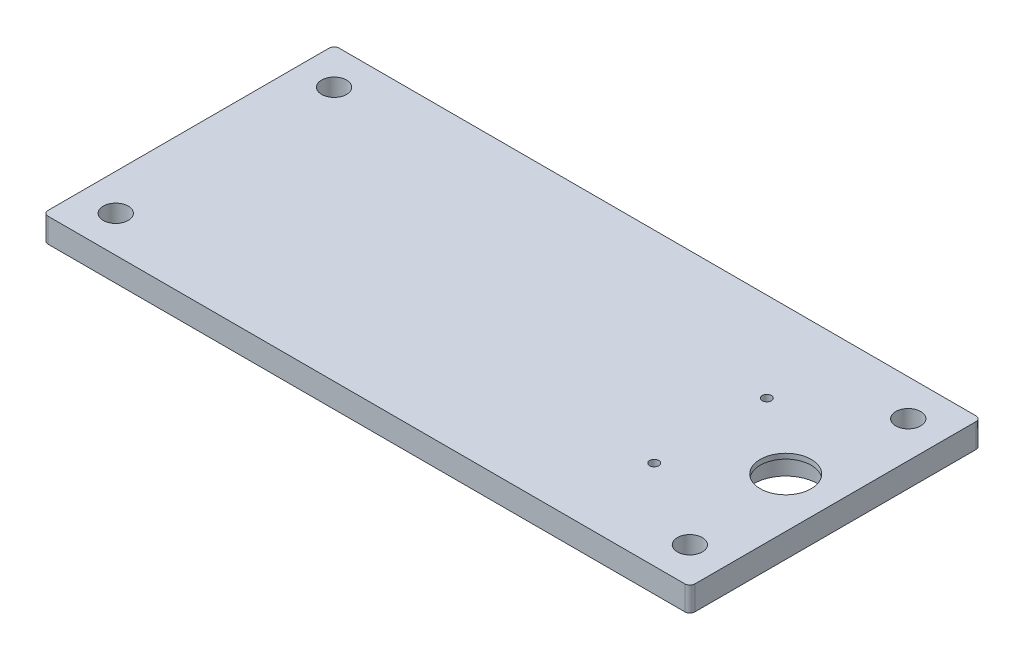
ISO-10303-21;
HEADER;
FILE_DESCRIPTION(('STEP AP214'),'2;1');
FILE_NAME('part.step','',(''),(''),'','','');
FILE_SCHEMA(('AUTOMOTIVE_DESIGN { 1 0 10303 214 1 1 1 1 }'));
ENDSEC;
DATA;
#1=APPLICATION_CONTEXT('core data for automotive mechanical design processes');
#2=APPLICATION_PROTOCOL_DEFINITION('international standard','automotive_design',2000,#1);
#3=PRODUCT_CONTEXT('',#1,'mechanical');
#4=PRODUCT('Part','Part','',(#3));
#5=PRODUCT_RELATED_PRODUCT_CATEGORY('part','',(#4));
#6=PRODUCT_DEFINITION_FORMATION('','',#4);
#7=PRODUCT_DEFINITION_CONTEXT('part definition',#1,'design');
#8=PRODUCT_DEFINITION('design','',#6,#7);
#9=PRODUCT_DEFINITION_SHAPE('','',#8);
#10=(LENGTH_UNIT() NAMED_UNIT(*) SI_UNIT(.MILLI.,.METRE.));
#11=(NAMED_UNIT(*) PLANE_ANGLE_UNIT() SI_UNIT($,.RADIAN.));
#12=(NAMED_UNIT(*) SI_UNIT($,.STERADIAN.) SOLID_ANGLE_UNIT());
#13=UNCERTAINTY_MEASURE_WITH_UNIT(LENGTH_MEASURE(1.E-05),#10,'distance_accuracy_value','');
#14=(GEOMETRIC_REPRESENTATION_CONTEXT(3) GLOBAL_UNCERTAINTY_ASSIGNED_CONTEXT((#13)) GLOBAL_UNIT_ASSIGNED_CONTEXT((#10,
#11,#12)) REPRESENTATION_CONTEXT('',''));
#15=CARTESIAN_POINT('',(0.,0.,0.));
#16=DIRECTION('',(0.,0.,1.));
#17=DIRECTION('',(1.,0.,0.));
#18=AXIS2_PLACEMENT_3D('',#15,#16,#17);
#19=CARTESIAN_POINT('',(107.475,0.,0.));
#20=DIRECTION('',(0.,1.,0.));
#21=DIRECTION('',(0.,0.,1.));
#22=AXIS2_PLACEMENT_3D('',#19,#20,#21);
#23=CYLINDRICAL_SURFACE('',#22,9.99999999999999);
#24=CARTESIAN_POINT('',(107.475,9.525,0.));
#25=DIRECTION('',(0.,1.,0.));
#26=DIRECTION('',(0.,0.,1.));
#27=AXIS2_PLACEMENT_3D('',#24,#25,#26);
#28=CIRCLE('',#27,9.99999999999999);
#29=CARTESIAN_POINT('',(107.475,9.525,9.99999999999999));
#30=VERTEX_POINT('',#29);
#31=EDGE_CURVE('E138',#30,#30,#28,.T.);
#32=CARTESIAN_POINT('',(107.475,7.525,0.));
#33=DIRECTION('',(0.,-1.,0.));
#34=DIRECTION('',(0.,0.,-1.));
#35=AXIS2_PLACEMENT_3D('',#32,#33,#34);
#36=CIRCLE('',#35,9.99999999999999);
#37=CARTESIAN_POINT('',(107.475,7.525,9.99999999999999));
#38=VERTEX_POINT('',#37);
#39=EDGE_CURVE('E228',#38,#38,#36,.F.);
#40=CARTESIAN_POINT('',(107.475,9.525,9.99999999999999));
#41=CARTESIAN_POINT('',(107.475,9.50416666666667,9.99999999999999));
#42=CARTESIAN_POINT('',(107.475,9.48333333333333,9.99999999999999));
#43=CARTESIAN_POINT('',(107.475,9.44166666666667,9.99999999999999));
#44=CARTESIAN_POINT('',(107.475,9.42083333333333,9.99999999999999));
#45=CARTESIAN_POINT('',(107.475,9.37916666666667,9.99999999999999));
#46=CARTESIAN_POINT('',(107.475,9.35833333333333,9.99999999999999));
#47=CARTESIAN_POINT('',(107.475,9.31666666666667,9.99999999999999));
#48=CARTESIAN_POINT('',(107.475,9.29583333333333,9.99999999999999));
#49=CARTESIAN_POINT('',(107.475,9.25416666666667,9.99999999999999));
#50=CARTESIAN_POINT('',(107.475,9.23333333333333,9.99999999999999));
#51=CARTESIAN_POINT('',(107.475,9.19166666666667,9.99999999999999));
#52=CARTESIAN_POINT('',(107.475,9.17083333333333,9.99999999999999));
#53=CARTESIAN_POINT('',(107.475,9.12916666666667,9.99999999999999));
#54=CARTESIAN_POINT('',(107.475,9.10833333333333,9.99999999999999));
#55=CARTESIAN_POINT('',(107.475,9.06666666666667,9.99999999999999));
#56=CARTESIAN_POINT('',(107.475,9.04583333333333,9.99999999999999));
#57=CARTESIAN_POINT('',(107.475,9.00416666666667,9.99999999999999));
#58=CARTESIAN_POINT('',(107.475,8.98333333333333,9.99999999999999));
#59=CARTESIAN_POINT('',(107.475,8.94166666666667,9.99999999999999));
#60=CARTESIAN_POINT('',(107.475,8.92083333333333,9.99999999999999));
#61=CARTESIAN_POINT('',(107.475,8.87916666666667,9.99999999999999));
#62=CARTESIAN_POINT('',(107.475,8.85833333333333,9.99999999999999));
#63=CARTESIAN_POINT('',(107.475,8.81666666666667,9.99999999999999));
#64=CARTESIAN_POINT('',(107.475,8.79583333333333,9.99999999999999));
#65=CARTESIAN_POINT('',(107.475,8.75416666666667,9.99999999999999));
#66=CARTESIAN_POINT('',(107.475,8.73333333333333,9.99999999999999));
#67=CARTESIAN_POINT('',(107.475,8.69166666666667,9.99999999999999));
#68=CARTESIAN_POINT('',(107.475,8.67083333333333,9.99999999999999));
#69=CARTESIAN_POINT('',(107.475,8.62916666666667,9.99999999999999));
#70=CARTESIAN_POINT('',(107.475,8.60833333333333,9.99999999999999));
#71=CARTESIAN_POINT('',(107.475,8.56666666666667,9.99999999999999));
#72=CARTESIAN_POINT('',(107.475,8.54583333333334,9.99999999999999));
#73=CARTESIAN_POINT('',(107.475,8.50416666666667,9.99999999999999));
#74=CARTESIAN_POINT('',(107.475,8.48333333333334,9.99999999999999));
#75=CARTESIAN_POINT('',(107.475,8.44166666666667,9.99999999999999));
#76=CARTESIAN_POINT('',(107.475,8.42083333333334,9.99999999999999));
#77=CARTESIAN_POINT('',(107.475,8.37916666666667,9.99999999999999));
#78=CARTESIAN_POINT('',(107.475,8.35833333333334,9.99999999999999));
#79=CARTESIAN_POINT('',(107.475,8.31666666666667,9.99999999999999));
#80=CARTESIAN_POINT('',(107.475,8.29583333333334,9.99999999999999));
#81=CARTESIAN_POINT('',(107.475,8.25416666666667,9.99999999999999));
#82=CARTESIAN_POINT('',(107.475,8.23333333333334,9.99999999999999));
#83=CARTESIAN_POINT('',(107.475,8.19166666666667,9.99999999999999));
#84=CARTESIAN_POINT('',(107.475,8.17083333333334,9.99999999999999));
#85=CARTESIAN_POINT('',(107.475,8.12916666666667,9.99999999999999));
#86=CARTESIAN_POINT('',(107.475,8.10833333333334,9.99999999999999));
#87=CARTESIAN_POINT('',(107.475,8.06666666666667,9.99999999999999));
#88=CARTESIAN_POINT('',(107.475,8.04583333333334,9.99999999999999));
#89=CARTESIAN_POINT('',(107.475,8.00416666666667,9.99999999999999));
#90=CARTESIAN_POINT('',(107.475,7.98333333333334,9.99999999999999));
#91=CARTESIAN_POINT('',(107.475,7.94166666666667,9.99999999999999));
#92=CARTESIAN_POINT('',(107.475,7.92083333333334,9.99999999999999));
#93=CARTESIAN_POINT('',(107.475,7.87916666666667,9.99999999999999));
#94=CARTESIAN_POINT('',(107.475,7.85833333333334,9.99999999999999));
#95=CARTESIAN_POINT('',(107.475,7.81666666666667,9.99999999999999));
#96=CARTESIAN_POINT('',(107.475,7.79583333333334,9.99999999999999));
#97=CARTESIAN_POINT('',(107.475,7.75416666666667,9.99999999999999));
#98=CARTESIAN_POINT('',(107.475,7.73333333333334,9.99999999999999));
#99=CARTESIAN_POINT('',(107.475,7.69166666666667,9.99999999999999));
#100=CARTESIAN_POINT('',(107.475,7.67083333333334,9.99999999999999));
#101=CARTESIAN_POINT('',(107.475,7.62916666666667,9.99999999999999));
#102=CARTESIAN_POINT('',(107.475,7.60833333333334,9.99999999999999));
#103=CARTESIAN_POINT('',(107.475,7.56666666666667,9.99999999999999));
#104=CARTESIAN_POINT('',(107.475,7.54583333333334,9.99999999999999));
#105=CARTESIAN_POINT('',(107.475,7.525,9.99999999999999));
#106=B_SPLINE_CURVE_WITH_KNOTS('',3,(#40,#41,#42,#43,#44,#45,#46,#47,#48,#49,#50,#51,#52,#53,
#54,#55,#56,#57,#58,#59,#60,#61,#62,#63,#64,#65,#66,#67,#68,#69,#70,#71,#72,#73,#74,#75,#76,#77,
#78,#79,#80,#81,#82,#83,#84,#85,#86,#87,#88,#89,#90,#91,#92,#93,#94,#95,#96,#97,#98,#99,#100,
#101,#102,#103,#104,#105),.UNSPECIFIED.,.F.,.F.,(4,2,2,2,2,2,2,2,2,2,2,2,2,2,2,2,2,2,2,2,2,2,2,
2,2,2,2,2,2,2,2,2,4),(0.,0.0625000000000001,0.125,0.1875,0.25,0.3125,0.374999999999999,
0.437499999999999,0.499999999999999,0.562499999999999,0.624999999999999,0.687499999999999,
0.749999999999999,0.812499999999999,0.874999999999999,0.937499999999999,0.999999999999997,
1.0625,1.125,1.1875,1.25,1.3125,1.375,1.4375,1.5,1.5625,1.625,1.6875,1.75,1.8125,1.875,1.9375,
2.),.UNSPECIFIED.);
#107=EDGE_CURVE('BSEAM44',#30,#38,#106,.T.);
#108=ORIENTED_EDGE('',*,*,#31,.T.);
#109=ORIENTED_EDGE('',*,*,#39,.F.);
#110=ORIENTED_EDGE('',*,*,#107,.T.);
#111=ORIENTED_EDGE('',*,*,#107,.F.);
#112=EDGE_LOOP('',(#108,#110,#109,#111));
#113=FACE_BOUND('',#112,.T.);
#114=ADVANCED_FACE('F44',(#113),#23,.F.);
#115=CARTESIAN_POINT('',(127.,9.525,57.15));
#116=DIRECTION('',(-1.,0.,0.));
#117=DIRECTION('',(0.,0.,1.));
#118=AXIS2_PLACEMENT_3D('',#115,#116,#117);
#119=PLANE('',#118);
#120=DIRECTION('',(0.,0.,-1.));
#121=VECTOR('',#120,1.);
#122=CARTESIAN_POINT('',(127.,9.525,57.15));
#123=LINE('',#122,#121);
#124=CARTESIAN_POINT('',(127.,9.525,55.15));
#125=VERTEX_POINT('',#124);
#126=CARTESIAN_POINT('',(127.,9.525,-55.15));
#127=VERTEX_POINT('',#126);
#128=EDGE_CURVE('E133',#125,#127,#123,.T.);
#129=ORIENTED_EDGE('',*,*,#128,.F.);
#130=DIRECTION('',(0.,-1.,0.));
#131=VECTOR('',#130,1.);
#132=CARTESIAN_POINT('',(127.,9.525,55.15));
#133=LINE('',#132,#131);
#134=CARTESIAN_POINT('',(127.,0.,55.15));
#135=VERTEX_POINT('',#134);
#136=EDGE_CURVE('E114',#125,#135,#133,.T.);
#137=ORIENTED_EDGE('',*,*,#136,.T.);
#138=DIRECTION('',(0.,0.,-1.));
#139=VECTOR('',#138,1.);
#140=CARTESIAN_POINT('',(127.,0.,57.15));
#141=LINE('',#140,#139);
#142=CARTESIAN_POINT('',(127.,0.,-55.15));
#143=VERTEX_POINT('',#142);
#144=EDGE_CURVE('E129',#135,#143,#141,.T.);
#145=ORIENTED_EDGE('',*,*,#144,.T.);
#146=DIRECTION('',(0.,-1.,0.));
#147=VECTOR('',#146,1.);
#148=CARTESIAN_POINT('',(127.,9.525,-55.15));
#149=LINE('',#148,#147);
#150=EDGE_CURVE('E132',#143,#127,#149,.F.);
#151=ORIENTED_EDGE('',*,*,#150,.T.);
#152=EDGE_LOOP('',(#129,#137,#145,#151));
#153=FACE_BOUND('',#152,.T.);
#154=ADVANCED_FACE('F130',(#153),#119,.F.);
#155=CARTESIAN_POINT('',(-127.,9.525,-57.15));
#156=DIRECTION('',(0.,0.,1.));
#157=DIRECTION('',(1.,0.,0.));
#158=AXIS2_PLACEMENT_3D('',#155,#156,#157);
#159=PLANE('',#158);
#160=DIRECTION('',(-1.,0.,0.));
#161=VECTOR('',#160,1.);
#162=CARTESIAN_POINT('',(-127.,0.,-57.15));
#163=LINE('',#162,#161);
#164=CARTESIAN_POINT('',(125.,0.,-57.15));
#165=VERTEX_POINT('',#164);
#166=CARTESIAN_POINT('',(-125.,0.,-57.15));
#167=VERTEX_POINT('',#166);
#168=EDGE_CURVE('E140',#165,#167,#163,.T.);
#169=ORIENTED_EDGE('',*,*,#168,.T.);
#170=DIRECTION('',(0.,-1.,0.));
#171=VECTOR('',#170,1.);
#172=CARTESIAN_POINT('',(-125.,9.525,-57.15));
#173=LINE('',#172,#171);
#174=CARTESIAN_POINT('',(-125.,9.525,-57.15));
#175=VERTEX_POINT('',#174);
#176=EDGE_CURVE('E12',#167,#175,#173,.F.);
#177=ORIENTED_EDGE('',*,*,#176,.T.);
#178=DIRECTION('',(-1.,0.,0.));
#179=VECTOR('',#178,1.);
#180=CARTESIAN_POINT('',(-127.,9.525,-57.15));
#181=LINE('',#180,#179);
#182=CARTESIAN_POINT('',(125.,9.525,-57.15));
#183=VERTEX_POINT('',#182);
#184=EDGE_CURVE('E187',#183,#175,#181,.T.);
#185=ORIENTED_EDGE('',*,*,#184,.F.);
#186=DIRECTION('',(0.,-1.,0.));
#187=VECTOR('',#186,1.);
#188=CARTESIAN_POINT('',(125.,9.525,-57.15));
#189=LINE('',#188,#187);
#190=EDGE_CURVE('E52',#183,#165,#189,.T.);
#191=ORIENTED_EDGE('',*,*,#190,.T.);
#192=EDGE_LOOP('',(#169,#177,#185,#191));
#193=FACE_BOUND('',#192,.T.);
#194=ADVANCED_FACE('F183',(#193),#159,.F.);
#195=CARTESIAN_POINT('',(-127.,9.525,57.15));
#196=DIRECTION('',(1.,0.,0.));
#197=DIRECTION('',(0.,0.,-1.));
#198=AXIS2_PLACEMENT_3D('',#195,#196,#197);
#199=PLANE('',#198);
#200=DIRECTION('',(0.,0.,1.));
#201=VECTOR('',#200,1.);
#202=CARTESIAN_POINT('',(-127.,0.,57.15));
#203=LINE('',#202,#201);
#204=CARTESIAN_POINT('',(-127.,0.,-55.15));
#205=VERTEX_POINT('',#204);
#206=CARTESIAN_POINT('',(-127.,0.,55.15));
#207=VERTEX_POINT('',#206);
#208=EDGE_CURVE('E142',#205,#207,#203,.T.);
#209=ORIENTED_EDGE('',*,*,#208,.T.);
#210=DIRECTION('',(0.,-1.,0.));
#211=VECTOR('',#210,1.);
#212=CARTESIAN_POINT('',(-127.,9.525,55.15));
#213=LINE('',#212,#211);
#214=CARTESIAN_POINT('',(-127.,9.525,55.15));
#215=VERTEX_POINT('',#214);
#216=EDGE_CURVE('E58',#207,#215,#213,.F.);
#217=ORIENTED_EDGE('',*,*,#216,.T.);
#218=DIRECTION('',(0.,0.,1.));
#219=VECTOR('',#218,1.);
#220=CARTESIAN_POINT('',(-127.,9.525,57.15));
#221=LINE('',#220,#219);
#222=CARTESIAN_POINT('',(-127.,9.525,-55.15));
#223=VERTEX_POINT('',#222);
#224=EDGE_CURVE('E191',#223,#215,#221,.T.);
#225=ORIENTED_EDGE('',*,*,#224,.F.);
#226=DIRECTION('',(0.,-1.,0.));
#227=VECTOR('',#226,1.);
#228=CARTESIAN_POINT('',(-127.,9.525,-55.15));
#229=LINE('',#228,#227);
#230=EDGE_CURVE('E180',#223,#205,#229,.T.);
#231=ORIENTED_EDGE('',*,*,#230,.T.);
#232=EDGE_LOOP('',(#209,#217,#225,#231));
#233=FACE_BOUND('',#232,.T.);
#234=ADVANCED_FACE('F194',(#233),#199,.F.);
#235=CARTESIAN_POINT('',(-127.,9.525,57.15));
#236=DIRECTION('',(0.,0.,-1.));
#237=DIRECTION('',(-1.,0.,0.));
#238=AXIS2_PLACEMENT_3D('',#235,#236,#237);
#239=PLANE('',#238);
#240=DIRECTION('',(1.,0.,0.));
#241=VECTOR('',#240,1.);
#242=CARTESIAN_POINT('',(-127.,0.,57.15));
#243=LINE('',#242,#241);
#244=CARTESIAN_POINT('',(-125.,0.,57.15));
#245=VERTEX_POINT('',#244);
#246=CARTESIAN_POINT('',(125.,0.,57.15));
#247=VERTEX_POINT('',#246);
#248=EDGE_CURVE('E153',#245,#247,#243,.T.);
#249=ORIENTED_EDGE('',*,*,#248,.T.);
#250=DIRECTION('',(0.,-1.,0.));
#251=VECTOR('',#250,1.);
#252=CARTESIAN_POINT('',(125.,9.525,57.15));
#253=LINE('',#252,#251);
#254=CARTESIAN_POINT('',(125.,9.525,57.15));
#255=VERTEX_POINT('',#254);
#256=EDGE_CURVE('E116',#247,#255,#253,.F.);
#257=ORIENTED_EDGE('',*,*,#256,.T.);
#258=DIRECTION('',(1.,0.,0.));
#259=VECTOR('',#258,1.);
#260=CARTESIAN_POINT('',(-127.,9.525,57.15));
#261=LINE('',#260,#259);
#262=CARTESIAN_POINT('',(-125.,9.525,57.15));
#263=VERTEX_POINT('',#262);
#264=EDGE_CURVE('E150',#263,#255,#261,.T.);
#265=ORIENTED_EDGE('',*,*,#264,.F.);
#266=DIRECTION('',(0.,-1.,0.));
#267=VECTOR('',#266,1.);
#268=CARTESIAN_POINT('',(-125.,9.525,57.15));
#269=LINE('',#268,#267);
#270=EDGE_CURVE('E122',#263,#245,#269,.T.);
#271=ORIENTED_EDGE('',*,*,#270,.T.);
#272=EDGE_LOOP('',(#249,#257,#265,#271));
#273=FACE_BOUND('',#272,.T.);
#274=ADVANCED_FACE('F263',(#273),#239,.F.);
#275=CARTESIAN_POINT('',(0.,9.525,0.));
#276=DIRECTION('',(0.,-1.,0.));
#277=DIRECTION('',(0.,0.,-1.));
#278=AXIS2_PLACEMENT_3D('',#275,#276,#277);
#279=PLANE('',#278);
#280=CARTESIAN_POINT('',(77.95,9.525,22.1));
#281=DIRECTION('',(0.,-1.,0.));
#282=DIRECTION('',(0.,0.,-1.));
#283=AXIS2_PLACEMENT_3D('',#280,#281,#282);
#284=CIRCLE('',#283,1.8);
#285=CARTESIAN_POINT('',(77.95,9.525,20.3));
#286=VERTEX_POINT('',#285);
#287=EDGE_CURVE('E216',#286,#286,#284,.T.);
#288=ORIENTED_EDGE('',*,*,#287,.T.);
#289=EDGE_LOOP('',(#288));
#290=FACE_BOUND('',#289,.T.);
#291=CARTESIAN_POINT('',(77.95,9.525,-22.1));
#292=DIRECTION('',(0.,-1.,0.));
#293=DIRECTION('',(0.,0.,-1.));
#294=AXIS2_PLACEMENT_3D('',#291,#292,#293);
#295=CIRCLE('',#294,1.8);
#296=CARTESIAN_POINT('',(77.95,9.525,-23.9));
#297=VERTEX_POINT('',#296);
#298=EDGE_CURVE('E211',#297,#297,#295,.T.);
#299=ORIENTED_EDGE('',*,*,#298,.T.);
#300=EDGE_LOOP('',(#299));
#301=FACE_BOUND('',#300,.T.);
#302=CARTESIAN_POINT('',(112.7125,9.525,-42.862500000001));
#303=DIRECTION('',(0.,1.,0.));
#304=DIRECTION('',(0.,0.,1.));
#305=AXIS2_PLACEMENT_3D('',#302,#303,#304);
#306=CIRCLE('',#305,4.9022);
#307=CARTESIAN_POINT('',(112.7125,9.525,-37.960300000001));
#308=VERTEX_POINT('',#307);
#309=EDGE_CURVE('E163',#308,#308,#306,.T.);
#310=ORIENTED_EDGE('',*,*,#309,.F.);
#311=EDGE_LOOP('',(#310));
#312=FACE_BOUND('',#311,.T.);
#313=CARTESIAN_POINT('',(112.7125,9.525,42.8674999999988));
#314=DIRECTION('',(0.,1.,0.));
#315=DIRECTION('',(0.,0.,1.));
#316=AXIS2_PLACEMENT_3D('',#313,#314,#315);
#317=CIRCLE('',#316,4.9022);
#318=CARTESIAN_POINT('',(112.7125,9.525,47.7696999999988));
#319=VERTEX_POINT('',#318);
#320=EDGE_CURVE('E160',#319,#319,#317,.T.);
#321=ORIENTED_EDGE('',*,*,#320,.F.);
#322=EDGE_LOOP('',(#321));
#323=FACE_BOUND('',#322,.T.);
#324=CARTESIAN_POINT('',(-112.7175,9.525,42.867499999999));
#325=DIRECTION('',(0.,1.,0.));
#326=DIRECTION('',(0.,0.,1.));
#327=AXIS2_PLACEMENT_3D('',#324,#325,#326);
#328=CIRCLE('',#327,4.9022);
#329=CARTESIAN_POINT('',(-112.7175,9.525,47.769699999999));
#330=VERTEX_POINT('',#329);
#331=EDGE_CURVE('E157',#330,#330,#328,.T.);
#332=ORIENTED_EDGE('',*,*,#331,.F.);
#333=EDGE_LOOP('',(#332));
#334=FACE_BOUND('',#333,.T.);
#335=CARTESIAN_POINT('',(-112.717499999998,9.525,-42.8625000000029));
#336=DIRECTION('',(0.,1.,0.));
#337=DIRECTION('',(0.,0.,1.));
#338=AXIS2_PLACEMENT_3D('',#335,#336,#337);
#339=CIRCLE('',#338,4.9022);
#340=CARTESIAN_POINT('',(-112.717499999998,9.525,-37.9603000000029));
#341=VERTEX_POINT('',#340);
#342=EDGE_CURVE('E205',#341,#341,#339,.T.);
#343=ORIENTED_EDGE('',*,*,#342,.F.);
#344=EDGE_LOOP('',(#343));
#345=FACE_BOUND('',#344,.T.);
#346=ORIENTED_EDGE('',*,*,#31,.F.);
#347=EDGE_LOOP('',(#346));
#348=FACE_BOUND('',#347,.T.);
#349=ORIENTED_EDGE('',*,*,#264,.T.);
#350=CARTESIAN_POINT('',(125.,9.525,55.15));
#351=DIRECTION('',(0.,-1.,0.));
#352=DIRECTION('',(0.,0.,-1.));
#353=AXIS2_PLACEMENT_3D('',#350,#351,#352);
#354=CIRCLE('',#353,2.);
#355=EDGE_CURVE('E174',#255,#125,#354,.F.);
#356=ORIENTED_EDGE('',*,*,#355,.T.);
#357=ORIENTED_EDGE('',*,*,#128,.T.);
#358=CARTESIAN_POINT('',(125.,9.525,-55.15));
#359=DIRECTION('',(0.,-1.,0.));
#360=DIRECTION('',(0.,0.,-1.));
#361=AXIS2_PLACEMENT_3D('',#358,#359,#360);
#362=CIRCLE('',#361,2.);
#363=EDGE_CURVE('E167',#127,#183,#362,.F.);
#364=ORIENTED_EDGE('',*,*,#363,.T.);
#365=ORIENTED_EDGE('',*,*,#184,.T.);
#366=CARTESIAN_POINT('',(-125.,9.525,-55.15));
#367=DIRECTION('',(0.,-1.,0.));
#368=DIRECTION('',(0.,0.,-1.));
#369=AXIS2_PLACEMENT_3D('',#366,#367,#368);
#370=CIRCLE('',#369,2.);
#371=EDGE_CURVE('E69',#175,#223,#370,.F.);
#372=ORIENTED_EDGE('',*,*,#371,.T.);
#373=ORIENTED_EDGE('',*,*,#224,.T.);
#374=CARTESIAN_POINT('',(-125.,9.525,55.15));
#375=DIRECTION('',(0.,-1.,0.));
#376=DIRECTION('',(0.,0.,-1.));
#377=AXIS2_PLACEMENT_3D('',#374,#375,#376);
#378=CIRCLE('',#377,2.);
#379=EDGE_CURVE('E173',#215,#263,#378,.F.);
#380=ORIENTED_EDGE('',*,*,#379,.T.);
#381=EDGE_LOOP('',(#349,#356,#357,#364,#365,#372,#373,#380));
#382=FACE_BOUND('',#381,.T.);
#383=ADVANCED_FACE('F259',(#290,#301,#312,#323,#334,#345,#348,#382),#279,.F.);
#384=CARTESIAN_POINT('',(0.,0.,0.));
#385=DIRECTION('',(0.,-1.,0.));
#386=DIRECTION('',(0.,0.,-1.));
#387=AXIS2_PLACEMENT_3D('',#384,#385,#386);
#388=PLANE('',#387);
#389=CARTESIAN_POINT('',(107.475,0.,0.));
#390=DIRECTION('',(0.,-1.,0.));
#391=DIRECTION('',(0.,0.,-1.));
#392=AXIS2_PLACEMENT_3D('',#389,#390,#391);
#393=CIRCLE('',#392,12.5);
#394=CARTESIAN_POINT('',(107.475,0.,-12.5));
#395=VERTEX_POINT('',#394);
#396=EDGE_CURVE('E229',#395,#395,#393,.T.);
#397=ORIENTED_EDGE('',*,*,#396,.F.);
#398=EDGE_LOOP('',(#397));
#399=FACE_BOUND('',#398,.T.);
#400=CARTESIAN_POINT('',(77.95,0.,22.1));
#401=DIRECTION('',(0.,-1.,0.));
#402=DIRECTION('',(0.,0.,-1.));
#403=AXIS2_PLACEMENT_3D('',#400,#401,#402);
#404=CIRCLE('',#403,1.8);
#405=CARTESIAN_POINT('',(77.95,0.,20.3));
#406=VERTEX_POINT('',#405);
#407=EDGE_CURVE('E223',#406,#406,#404,.T.);
#408=ORIENTED_EDGE('',*,*,#407,.F.);
#409=EDGE_LOOP('',(#408));
#410=FACE_BOUND('',#409,.T.);
#411=CARTESIAN_POINT('',(77.95,0.,-22.1));
#412=DIRECTION('',(0.,-1.,0.));
#413=DIRECTION('',(0.,0.,-1.));
#414=AXIS2_PLACEMENT_3D('',#411,#412,#413);
#415=CIRCLE('',#414,1.8);
#416=CARTESIAN_POINT('',(77.95,0.,-23.9));
#417=VERTEX_POINT('',#416);
#418=EDGE_CURVE('E219',#417,#417,#415,.T.);
#419=ORIENTED_EDGE('',*,*,#418,.F.);
#420=EDGE_LOOP('',(#419));
#421=FACE_BOUND('',#420,.T.);
#422=CARTESIAN_POINT('',(112.7125,0.,-42.862500000001));
#423=DIRECTION('',(0.,-1.,0.));
#424=DIRECTION('',(0.,0.,-1.));
#425=AXIS2_PLACEMENT_3D('',#422,#423,#424);
#426=CIRCLE('',#425,4.9022);
#427=CARTESIAN_POINT('',(112.7125,0.,-47.764700000001));
#428=VERTEX_POINT('',#427);
#429=EDGE_CURVE('E158',#428,#428,#426,.T.);
#430=ORIENTED_EDGE('',*,*,#429,.F.);
#431=EDGE_LOOP('',(#430));
#432=FACE_BOUND('',#431,.T.);
#433=CARTESIAN_POINT('',(112.7125,0.,42.8674999999988));
#434=DIRECTION('',(0.,-1.,0.));
#435=DIRECTION('',(0.,0.,-1.));
#436=AXIS2_PLACEMENT_3D('',#433,#434,#435);
#437=CIRCLE('',#436,4.9022);
#438=CARTESIAN_POINT('',(112.7125,0.,37.9652999999988));
#439=VERTEX_POINT('',#438);
#440=EDGE_CURVE('E152',#439,#439,#437,.T.);
#441=ORIENTED_EDGE('',*,*,#440,.F.);
#442=EDGE_LOOP('',(#441));
#443=FACE_BOUND('',#442,.T.);
#444=CARTESIAN_POINT('',(-112.7175,0.,42.867499999999));
#445=DIRECTION('',(0.,-1.,0.));
#446=DIRECTION('',(0.,0.,-1.));
#447=AXIS2_PLACEMENT_3D('',#444,#445,#446);
#448=CIRCLE('',#447,4.9022);
#449=CARTESIAN_POINT('',(-112.7175,0.,37.965299999999));
#450=VERTEX_POINT('',#449);
#451=EDGE_CURVE('E201',#450,#450,#448,.T.);
#452=ORIENTED_EDGE('',*,*,#451,.F.);
#453=EDGE_LOOP('',(#452));
#454=FACE_BOUND('',#453,.T.);
#455=CARTESIAN_POINT('',(-112.717499999998,0.,-42.8625000000029));
#456=DIRECTION('',(0.,-1.,0.));
#457=DIRECTION('',(0.,0.,-1.));
#458=AXIS2_PLACEMENT_3D('',#455,#456,#457);
#459=CIRCLE('',#458,4.9022);
#460=CARTESIAN_POINT('',(-112.717499999998,0.,-47.7647000000029));
#461=VERTEX_POINT('',#460);
#462=EDGE_CURVE('E144',#461,#461,#459,.T.);
#463=ORIENTED_EDGE('',*,*,#462,.F.);
#464=EDGE_LOOP('',(#463));
#465=FACE_BOUND('',#464,.T.);
#466=ORIENTED_EDGE('',*,*,#144,.F.);
#467=CARTESIAN_POINT('',(125.,0.,55.15));
#468=DIRECTION('',(0.,-1.,0.));
#469=DIRECTION('',(0.,0.,-1.));
#470=AXIS2_PLACEMENT_3D('',#467,#468,#469);
#471=CIRCLE('',#470,2.);
#472=EDGE_CURVE('E111',#135,#247,#471,.T.);
#473=ORIENTED_EDGE('',*,*,#472,.T.);
#474=ORIENTED_EDGE('',*,*,#248,.F.);
#475=CARTESIAN_POINT('',(-125.,0.,55.15));
#476=DIRECTION('',(0.,-1.,0.));
#477=DIRECTION('',(0.,0.,-1.));
#478=AXIS2_PLACEMENT_3D('',#475,#476,#477);
#479=CIRCLE('',#478,2.);
#480=EDGE_CURVE('E125',#245,#207,#479,.T.);
#481=ORIENTED_EDGE('',*,*,#480,.T.);
#482=ORIENTED_EDGE('',*,*,#208,.F.);
#483=CARTESIAN_POINT('',(-125.,0.,-55.15));
#484=DIRECTION('',(0.,-1.,0.));
#485=DIRECTION('',(0.,0.,-1.));
#486=AXIS2_PLACEMENT_3D('',#483,#484,#485);
#487=CIRCLE('',#486,2.);
#488=EDGE_CURVE('E165',#205,#167,#487,.T.);
#489=ORIENTED_EDGE('',*,*,#488,.T.);
#490=ORIENTED_EDGE('',*,*,#168,.F.);
#491=CARTESIAN_POINT('',(125.,0.,-55.15));
#492=DIRECTION('',(0.,-1.,0.));
#493=DIRECTION('',(0.,0.,-1.));
#494=AXIS2_PLACEMENT_3D('',#491,#492,#493);
#495=CIRCLE('',#494,2.);
#496=EDGE_CURVE('E134',#165,#143,#495,.T.);
#497=ORIENTED_EDGE('',*,*,#496,.T.);
#498=EDGE_LOOP('',(#466,#473,#474,#481,#482,#489,#490,#497));
#499=FACE_BOUND('',#498,.T.);
#500=ADVANCED_FACE('F131',(#399,#410,#421,#432,#443,#454,#465,#499),#388,.T.);
#501=CARTESIAN_POINT('',(-112.717499999998,9.525,-42.8625000000029));
#502=DIRECTION('',(0.,1.,0.));
#503=DIRECTION('',(0.,0.,1.));
#504=AXIS2_PLACEMENT_3D('',#501,#502,#503);
#505=CYLINDRICAL_SURFACE('',#504,4.9022);
#506=ORIENTED_EDGE('',*,*,#462,.T.);
#507=EDGE_LOOP('',(#506));
#508=FACE_BOUND('',#507,.T.);
#509=ORIENTED_EDGE('',*,*,#342,.T.);
#510=EDGE_LOOP('',(#509));
#511=FACE_BOUND('',#510,.T.);
#512=ADVANCED_FACE('F257',(#508,#511),#505,.F.);
#513=CARTESIAN_POINT('',(-112.7175,9.525,42.867499999999));
#514=DIRECTION('',(0.,1.,0.));
#515=DIRECTION('',(0.,0.,1.));
#516=AXIS2_PLACEMENT_3D('',#513,#514,#515);
#517=CYLINDRICAL_SURFACE('',#516,4.9022);
#518=ORIENTED_EDGE('',*,*,#451,.T.);
#519=EDGE_LOOP('',(#518));
#520=FACE_BOUND('',#519,.T.);
#521=ORIENTED_EDGE('',*,*,#331,.T.);
#522=EDGE_LOOP('',(#521));
#523=FACE_BOUND('',#522,.T.);
#524=ADVANCED_FACE('F303',(#520,#523),#517,.F.);
#525=CARTESIAN_POINT('',(112.7125,9.525,42.8674999999988));
#526=DIRECTION('',(0.,1.,0.));
#527=DIRECTION('',(0.,0.,1.));
#528=AXIS2_PLACEMENT_3D('',#525,#526,#527);
#529=CYLINDRICAL_SURFACE('',#528,4.9022);
#530=ORIENTED_EDGE('',*,*,#440,.T.);
#531=EDGE_LOOP('',(#530));
#532=FACE_BOUND('',#531,.T.);
#533=ORIENTED_EDGE('',*,*,#320,.T.);
#534=EDGE_LOOP('',(#533));
#535=FACE_BOUND('',#534,.T.);
#536=ADVANCED_FACE('F297',(#532,#535),#529,.F.);
#537=CARTESIAN_POINT('',(112.7125,9.525,-42.862500000001));
#538=DIRECTION('',(0.,1.,0.));
#539=DIRECTION('',(0.,0.,1.));
#540=AXIS2_PLACEMENT_3D('',#537,#538,#539);
#541=CYLINDRICAL_SURFACE('',#540,4.9022);
#542=ORIENTED_EDGE('',*,*,#429,.T.);
#543=EDGE_LOOP('',(#542));
#544=FACE_BOUND('',#543,.T.);
#545=ORIENTED_EDGE('',*,*,#309,.T.);
#546=EDGE_LOOP('',(#545));
#547=FACE_BOUND('',#546,.T.);
#548=ADVANCED_FACE('F273',(#544,#547),#541,.F.);
#549=CARTESIAN_POINT('',(125.,9.525,55.15));
#550=DIRECTION('',(0.,-1.,0.));
#551=DIRECTION('',(0.,0.,-1.));
#552=AXIS2_PLACEMENT_3D('',#549,#550,#551);
#553=CYLINDRICAL_SURFACE('',#552,2.);
#554=ORIENTED_EDGE('',*,*,#355,.F.);
#555=ORIENTED_EDGE('',*,*,#256,.F.);
#556=ORIENTED_EDGE('',*,*,#472,.F.);
#557=ORIENTED_EDGE('',*,*,#136,.F.);
#558=EDGE_LOOP('',(#554,#555,#556,#557));
#559=FACE_BOUND('',#558,.T.);
#560=ADVANCED_FACE('F112',(#559),#553,.T.);
#561=CARTESIAN_POINT('',(-125.,9.525,55.15));
#562=DIRECTION('',(0.,-1.,0.));
#563=DIRECTION('',(0.,0.,-1.));
#564=AXIS2_PLACEMENT_3D('',#561,#562,#563);
#565=CYLINDRICAL_SURFACE('',#564,2.);
#566=ORIENTED_EDGE('',*,*,#379,.F.);
#567=ORIENTED_EDGE('',*,*,#216,.F.);
#568=ORIENTED_EDGE('',*,*,#480,.F.);
#569=ORIENTED_EDGE('',*,*,#270,.F.);
#570=EDGE_LOOP('',(#566,#567,#568,#569));
#571=FACE_BOUND('',#570,.T.);
#572=ADVANCED_FACE('F274',(#571),#565,.T.);
#573=CARTESIAN_POINT('',(-125.,9.525,-55.15));
#574=DIRECTION('',(0.,-1.,0.));
#575=DIRECTION('',(0.,0.,-1.));
#576=AXIS2_PLACEMENT_3D('',#573,#574,#575);
#577=CYLINDRICAL_SURFACE('',#576,2.);
#578=ORIENTED_EDGE('',*,*,#371,.F.);
#579=ORIENTED_EDGE('',*,*,#176,.F.);
#580=ORIENTED_EDGE('',*,*,#488,.F.);
#581=ORIENTED_EDGE('',*,*,#230,.F.);
#582=EDGE_LOOP('',(#578,#579,#580,#581));
#583=FACE_BOUND('',#582,.T.);
#584=ADVANCED_FACE('F195',(#583),#577,.T.);
#585=CARTESIAN_POINT('',(125.,9.525,-55.15));
#586=DIRECTION('',(0.,-1.,0.));
#587=DIRECTION('',(0.,0.,-1.));
#588=AXIS2_PLACEMENT_3D('',#585,#586,#587);
#589=CYLINDRICAL_SURFACE('',#588,2.);
#590=ORIENTED_EDGE('',*,*,#363,.F.);
#591=ORIENTED_EDGE('',*,*,#150,.F.);
#592=ORIENTED_EDGE('',*,*,#496,.F.);
#593=ORIENTED_EDGE('',*,*,#190,.F.);
#594=EDGE_LOOP('',(#590,#591,#592,#593));
#595=FACE_BOUND('',#594,.T.);
#596=ADVANCED_FACE('F50',(#595),#589,.T.);
#597=CARTESIAN_POINT('',(77.95,0.,-22.1));
#598=DIRECTION('',(0.,-1.,0.));
#599=DIRECTION('',(0.,0.,-1.));
#600=AXIS2_PLACEMENT_3D('',#597,#598,#599);
#601=CYLINDRICAL_SURFACE('',#600,1.8);
#602=ORIENTED_EDGE('',*,*,#418,.T.);
#603=EDGE_LOOP('',(#602));
#604=FACE_BOUND('',#603,.T.);
#605=ORIENTED_EDGE('',*,*,#298,.F.);
#606=EDGE_LOOP('',(#605));
#607=FACE_BOUND('',#606,.T.);
#608=ADVANCED_FACE('F284',(#604,#607),#601,.F.);
#609=CARTESIAN_POINT('',(77.95,0.,22.1));
#610=DIRECTION('',(0.,-1.,0.));
#611=DIRECTION('',(0.,0.,-1.));
#612=AXIS2_PLACEMENT_3D('',#609,#610,#611);
#613=CYLINDRICAL_SURFACE('',#612,1.8);
#614=ORIENTED_EDGE('',*,*,#407,.T.);
#615=EDGE_LOOP('',(#614));
#616=FACE_BOUND('',#615,.T.);
#617=ORIENTED_EDGE('',*,*,#287,.F.);
#618=EDGE_LOOP('',(#617));
#619=FACE_BOUND('',#618,.T.);
#620=ADVANCED_FACE('F287',(#616,#619),#613,.F.);
#621=CARTESIAN_POINT('',(107.475,44.8803390593274,0.));
#622=DIRECTION('',(0.,-1.,0.));
#623=DIRECTION('',(0.,0.,-1.));
#624=AXIS2_PLACEMENT_3D('',#621,#622,#623);
#625=CYLINDRICAL_SURFACE('',#624,12.5);
#626=CARTESIAN_POINT('',(107.475,7.525,0.));
#627=DIRECTION('',(0.,-1.,0.));
#628=DIRECTION('',(0.,0.,-1.));
#629=AXIS2_PLACEMENT_3D('',#626,#627,#628);
#630=CIRCLE('',#629,12.5);
#631=CARTESIAN_POINT('',(107.475,7.525,-12.5));
#632=VERTEX_POINT('',#631);
#633=EDGE_CURVE('E230',#632,#632,#630,.F.);
#634=ORIENTED_EDGE('',*,*,#633,.T.);
#635=EDGE_LOOP('',(#634));
#636=FACE_BOUND('',#635,.T.);
#637=ORIENTED_EDGE('',*,*,#396,.T.);
#638=EDGE_LOOP('',(#637));
#639=FACE_BOUND('',#638,.T.);
#640=ADVANCED_FACE('F236',(#636,#639),#625,.F.);
#641=CARTESIAN_POINT('',(0.,7.525,0.));
#642=DIRECTION('',(0.,-1.,0.));
#643=DIRECTION('',(0.,0.,-1.));
#644=AXIS2_PLACEMENT_3D('',#641,#642,#643);
#645=PLANE('',#644);
#646=ORIENTED_EDGE('',*,*,#633,.F.);
#647=EDGE_LOOP('',(#646));
#648=FACE_BOUND('',#647,.T.);
#649=ORIENTED_EDGE('',*,*,#39,.T.);
#650=EDGE_LOOP('',(#649));
#651=FACE_BOUND('',#650,.T.);
#652=ADVANCED_FACE('F237',(#648,#651),#645,.T.);
#653=CLOSED_SHELL('',(#114,#154,#194,#234,#274,#383,#500,#512,#524,#536,#548,#560,#572,#584,
#596,#608,#620,#640,#652));
#654=MANIFOLD_SOLID_BREP('B2',#653);
#655=ADVANCED_BREP_SHAPE_REPRESENTATION('',(#18,#654),#14);
#656=SHAPE_DEFINITION_REPRESENTATION(#9,#655);
ENDSEC;
END-ISO-10303-21;
